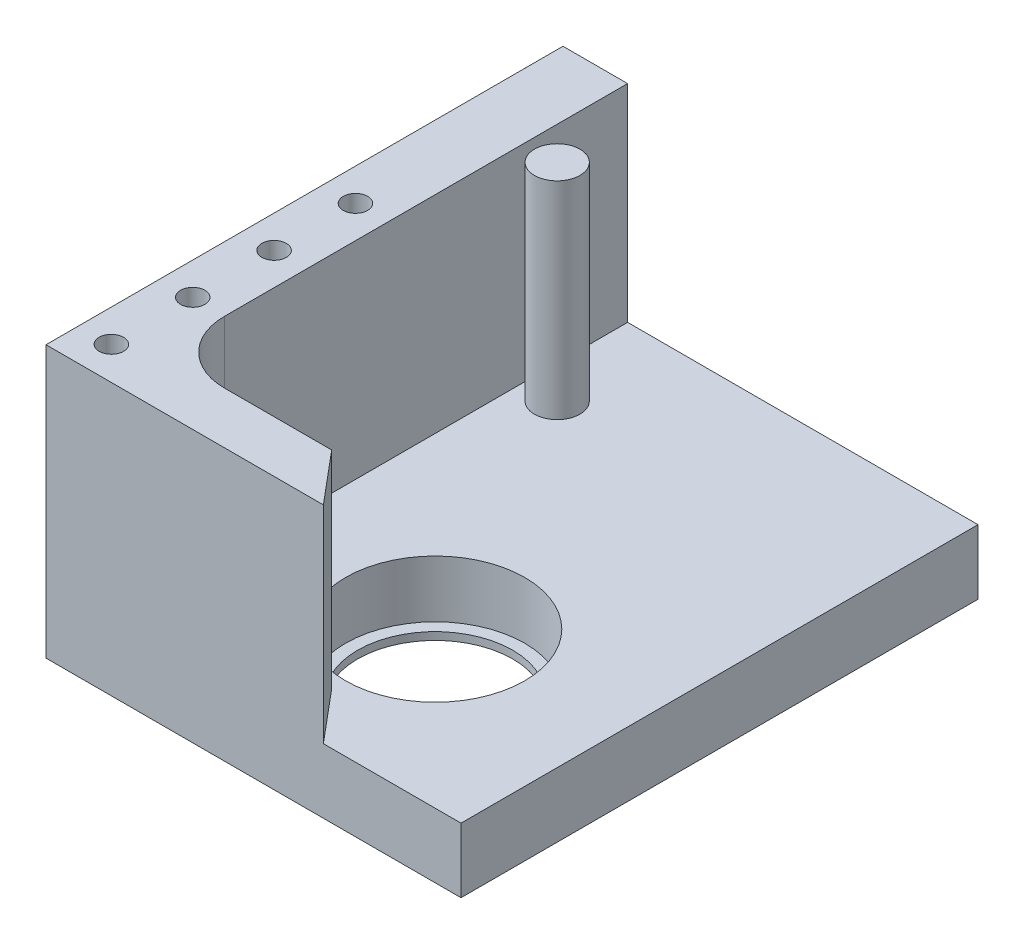
ISO-10303-21;
HEADER;
FILE_DESCRIPTION(('STEP AP214'),'2;1');
FILE_NAME('part.step','',(''),(''),'','','');
FILE_SCHEMA(('AUTOMOTIVE_DESIGN { 1 0 10303 214 1 1 1 1 }'));
ENDSEC;
DATA;
#1=APPLICATION_CONTEXT('core data for automotive mechanical design processes');
#2=APPLICATION_PROTOCOL_DEFINITION('international standard','automotive_design',2000,#1);
#3=PRODUCT_CONTEXT('',#1,'mechanical');
#4=PRODUCT('Part','Part','',(#3));
#5=PRODUCT_RELATED_PRODUCT_CATEGORY('part','',(#4));
#6=PRODUCT_DEFINITION_FORMATION('','',#4);
#7=PRODUCT_DEFINITION_CONTEXT('part definition',#1,'design');
#8=PRODUCT_DEFINITION('design','',#6,#7);
#9=PRODUCT_DEFINITION_SHAPE('','',#8);
#10=(LENGTH_UNIT() NAMED_UNIT(*) SI_UNIT(.MILLI.,.METRE.));
#11=(NAMED_UNIT(*) PLANE_ANGLE_UNIT() SI_UNIT($,.RADIAN.));
#12=(NAMED_UNIT(*) SI_UNIT($,.STERADIAN.) SOLID_ANGLE_UNIT());
#13=UNCERTAINTY_MEASURE_WITH_UNIT(LENGTH_MEASURE(1.E-05),#10,'distance_accuracy_value','');
#14=(GEOMETRIC_REPRESENTATION_CONTEXT(3) GLOBAL_UNCERTAINTY_ASSIGNED_CONTEXT((#13)) GLOBAL_UNIT_ASSIGNED_CONTEXT((#10,
#11,#12)) REPRESENTATION_CONTEXT('',''));
#15=CARTESIAN_POINT('',(0.,0.,0.));
#16=DIRECTION('',(0.,0.,1.));
#17=DIRECTION('',(1.,0.,0.));
#18=AXIS2_PLACEMENT_3D('',#15,#16,#17);
#19=CARTESIAN_POINT('',(0.,7.9375,0.));
#20=DIRECTION('',(0.,1.,0.));
#21=DIRECTION('',(0.,0.,1.));
#22=AXIS2_PLACEMENT_3D('',#19,#20,#21);
#23=PLANE('',#22);
#24=CARTESIAN_POINT('',(-16.7612,7.9375,-31.75));
#25=DIRECTION('',(0.,1.,0.));
#26=DIRECTION('',(0.,0.,1.));
#27=AXIS2_PLACEMENT_3D('',#24,#25,#26);
#28=CIRCLE('',#27,2.794);
#29=CARTESIAN_POINT('',(-16.7612,7.9375,-28.956));
#30=VERTEX_POINT('',#29);
#31=EDGE_CURVE('E140',#30,#30,#28,.T.);
#32=ORIENTED_EDGE('',*,*,#31,.F.);
#33=EDGE_LOOP('',(#32));
#34=FACE_BOUND('',#33,.T.);
#35=DIRECTION('',(0.,0.,-1.));
#36=VECTOR('',#35,1.);
#37=CARTESIAN_POINT('',(-20.8125,7.9375,19.05));
#38=LINE('',#37,#36);
#39=CARTESIAN_POINT('',(-20.8125,7.9375,5.08));
#40=VERTEX_POINT('',#39);
#41=CARTESIAN_POINT('',(-20.8125,7.9375,-44.45));
#42=VERTEX_POINT('',#41);
#43=EDGE_CURVE('E191',#40,#42,#38,.T.);
#44=ORIENTED_EDGE('',*,*,#43,.F.);
#45=CARTESIAN_POINT('',(-13.1925,7.9375,5.08));
#46=DIRECTION('',(0.,1.,0.));
#47=DIRECTION('',(0.,0.,1.));
#48=AXIS2_PLACEMENT_3D('',#45,#46,#47);
#49=CIRCLE('',#48,7.62);
#50=CARTESIAN_POINT('',(-13.1925,7.9375,12.7));
#51=VERTEX_POINT('',#50);
#52=EDGE_CURVE('E49',#40,#51,#49,.T.);
#53=ORIENTED_EDGE('',*,*,#52,.T.);
#54=DIRECTION('',(-1.,0.,0.));
#55=VECTOR('',#54,1.);
#56=CARTESIAN_POINT('',(-0.00989999999998978,7.9375,12.7));
#57=LINE('',#56,#55);
#58=CARTESIAN_POINT('',(-0.00989999999998978,7.9375,12.7));
#59=VERTEX_POINT('',#58);
#60=EDGE_CURVE('E188',#59,#51,#57,.T.);
#61=ORIENTED_EDGE('',*,*,#60,.F.);
#62=DIRECTION('',(0.642787609686535,0.,0.766044443118982));
#63=VECTOR('',#62,1.);
#64=CARTESIAN_POINT('',(-0.00989999999998978,7.9375,12.7));
#65=LINE('',#64,#63);
#66=CARTESIAN_POINT('',(5.31838265797568,7.9375,19.05));
#67=VERTEX_POINT('',#66);
#68=EDGE_CURVE('E181',#59,#67,#65,.T.);
#69=ORIENTED_EDGE('',*,*,#68,.T.);
#70=DIRECTION('',(-1.,0.,0.));
#71=VECTOR('',#70,1.);
#72=CARTESIAN_POINT('',(22.225,7.9375,19.05));
#73=LINE('',#72,#71);
#74=CARTESIAN_POINT('',(22.225,7.9375,19.05));
#75=VERTEX_POINT('',#74);
#76=EDGE_CURVE('E120',#75,#67,#73,.T.);
#77=ORIENTED_EDGE('',*,*,#76,.F.);
#78=DIRECTION('',(0.,0.,1.));
#79=VECTOR('',#78,1.);
#80=CARTESIAN_POINT('',(22.225,7.9375,-19.05));
#81=LINE('',#80,#79);
#82=CARTESIAN_POINT('',(22.225,7.9375,-44.45));
#83=VERTEX_POINT('',#82);
#84=EDGE_CURVE('E213',#83,#75,#81,.T.);
#85=ORIENTED_EDGE('',*,*,#84,.F.);
#86=DIRECTION('',(1.,0.,0.));
#87=VECTOR('',#86,1.);
#88=CARTESIAN_POINT('',(22.225,7.9375,-44.45));
#89=LINE('',#88,#87);
#90=EDGE_CURVE('E136',#42,#83,#89,.T.);
#91=ORIENTED_EDGE('',*,*,#90,.F.);
#92=EDGE_LOOP('',(#44,#53,#61,#69,#77,#85,#91));
#93=FACE_BOUND('',#92,.T.);
#94=CARTESIAN_POINT('',(0.,7.9375,0.));
#95=DIRECTION('',(0.,1.,0.));
#96=DIRECTION('',(0.,0.,1.));
#97=AXIS2_PLACEMENT_3D('',#94,#95,#96);
#98=CIRCLE('',#97,11.);
#99=CARTESIAN_POINT('',(0.,7.9375,11.));
#100=VERTEX_POINT('',#99);
#101=EDGE_CURVE('E208',#100,#100,#98,.T.);
#102=ORIENTED_EDGE('',*,*,#101,.F.);
#103=EDGE_LOOP('',(#102));
#104=FACE_BOUND('',#103,.T.);
#105=ADVANCED_FACE('F41',(#34,#93,#104),#23,.T.);
#106=CARTESIAN_POINT('',(-20.8125,33.3375,19.05));
#107=DIRECTION('',(-1.,0.,0.));
#108=DIRECTION('',(0.,0.,1.));
#109=AXIS2_PLACEMENT_3D('',#106,#107,#108);
#110=PLANE('',#109);
#111=DIRECTION('',(0.,0.,-1.));
#112=VECTOR('',#111,1.);
#113=CARTESIAN_POINT('',(-20.8125,33.3375,19.05));
#114=LINE('',#113,#112);
#115=CARTESIAN_POINT('',(-20.8125,33.3375,5.08000000000001));
#116=VERTEX_POINT('',#115);
#117=CARTESIAN_POINT('',(-20.8125,33.3375,-44.45));
#118=VERTEX_POINT('',#117);
#119=EDGE_CURVE('E197',#116,#118,#114,.T.);
#120=ORIENTED_EDGE('',*,*,#119,.F.);
#121=DIRECTION('',(0.,1.,0.));
#122=VECTOR('',#121,1.);
#123=CARTESIAN_POINT('',(-20.8125,7.9375,5.08));
#124=LINE('',#123,#122);
#125=EDGE_CURVE('E61',#116,#40,#124,.F.);
#126=ORIENTED_EDGE('',*,*,#125,.T.);
#127=ORIENTED_EDGE('',*,*,#43,.T.);
#128=DIRECTION('',(0.,-1.,0.));
#129=VECTOR('',#128,1.);
#130=CARTESIAN_POINT('',(-20.8125,7.9375,-44.45));
#131=LINE('',#130,#129);
#132=EDGE_CURVE('E148',#118,#42,#131,.T.);
#133=ORIENTED_EDGE('',*,*,#132,.F.);
#134=EDGE_LOOP('',(#120,#126,#127,#133));
#135=FACE_BOUND('',#134,.T.);
#136=ADVANCED_FACE('F248',(#135),#110,.F.);
#137=CARTESIAN_POINT('',(22.225,7.9375,19.05));
#138=DIRECTION('',(0.,0.,1.));
#139=DIRECTION('',(1.,0.,0.));
#140=AXIS2_PLACEMENT_3D('',#137,#138,#139);
#141=PLANE('',#140);
#142=DIRECTION('',(-1.,0.,0.));
#143=VECTOR('',#142,1.);
#144=CARTESIAN_POINT('',(22.225,0.,19.05));
#145=LINE('',#144,#143);
#146=CARTESIAN_POINT('',(22.225,0.,19.05));
#147=VERTEX_POINT('',#146);
#148=CARTESIAN_POINT('',(-28.75,0.,19.05));
#149=VERTEX_POINT('',#148);
#150=EDGE_CURVE('E207',#147,#149,#145,.T.);
#151=ORIENTED_EDGE('',*,*,#150,.F.);
#152=DIRECTION('',(0.,-1.,0.));
#153=VECTOR('',#152,1.);
#154=CARTESIAN_POINT('',(22.225,7.9375,19.05));
#155=LINE('',#154,#153);
#156=EDGE_CURVE('E116',#75,#147,#155,.T.);
#157=ORIENTED_EDGE('',*,*,#156,.F.);
#158=ORIENTED_EDGE('',*,*,#76,.T.);
#159=DIRECTION('',(0.,1.,0.));
#160=VECTOR('',#159,1.);
#161=CARTESIAN_POINT('',(5.31838265797567,-0.002000000000002,19.05));
#162=LINE('',#161,#160);
#163=CARTESIAN_POINT('',(5.31838265797567,33.3375,19.05));
#164=VERTEX_POINT('',#163);
#165=EDGE_CURVE('E178',#67,#164,#162,.T.);
#166=ORIENTED_EDGE('',*,*,#165,.T.);
#167=DIRECTION('',(1.,0.,0.));
#168=VECTOR('',#167,1.);
#169=CARTESIAN_POINT('',(-28.75,33.3375,19.05));
#170=LINE('',#169,#168);
#171=CARTESIAN_POINT('',(-28.75,33.3375,19.05));
#172=VERTEX_POINT('',#171);
#173=EDGE_CURVE('E195',#172,#164,#170,.T.);
#174=ORIENTED_EDGE('',*,*,#173,.F.);
#175=DIRECTION('',(0.,-1.,0.));
#176=VECTOR('',#175,1.);
#177=CARTESIAN_POINT('',(-28.75,7.9375,19.05));
#178=LINE('',#177,#176);
#179=EDGE_CURVE('E215',#172,#149,#178,.T.);
#180=ORIENTED_EDGE('',*,*,#179,.T.);
#181=EDGE_LOOP('',(#151,#157,#158,#166,#174,#180));
#182=FACE_BOUND('',#181,.T.);
#183=ADVANCED_FACE('F256',(#182),#141,.T.);
#184=CARTESIAN_POINT('',(22.225,7.9375,-19.05));
#185=DIRECTION('',(1.,0.,0.));
#186=DIRECTION('',(0.,0.,-1.));
#187=AXIS2_PLACEMENT_3D('',#184,#185,#186);
#188=PLANE('',#187);
#189=DIRECTION('',(0.,0.,1.));
#190=VECTOR('',#189,1.);
#191=CARTESIAN_POINT('',(22.225,0.,-19.05));
#192=LINE('',#191,#190);
#193=CARTESIAN_POINT('',(22.225,0.,-44.45));
#194=VERTEX_POINT('',#193);
#195=EDGE_CURVE('E110',#194,#147,#192,.T.);
#196=ORIENTED_EDGE('',*,*,#195,.F.);
#197=DIRECTION('',(0.,-1.,0.));
#198=VECTOR('',#197,1.);
#199=CARTESIAN_POINT('',(22.225,0.,-44.45));
#200=LINE('',#199,#198);
#201=EDGE_CURVE('E115',#83,#194,#200,.T.);
#202=ORIENTED_EDGE('',*,*,#201,.F.);
#203=ORIENTED_EDGE('',*,*,#84,.T.);
#204=ORIENTED_EDGE('',*,*,#156,.T.);
#205=EDGE_LOOP('',(#196,#202,#203,#204));
#206=FACE_BOUND('',#205,.T.);
#207=ADVANCED_FACE('F112',(#206),#188,.T.);
#208=CARTESIAN_POINT('',(-28.75,7.9375,-19.05));
#209=DIRECTION('',(1.,0.,0.));
#210=DIRECTION('',(0.,0.,-1.));
#211=AXIS2_PLACEMENT_3D('',#208,#209,#210);
#212=PLANE('',#211);
#213=DIRECTION('',(0.,0.,1.));
#214=VECTOR('',#213,1.);
#215=CARTESIAN_POINT('',(-28.75,0.,-19.05));
#216=LINE('',#215,#214);
#217=CARTESIAN_POINT('',(-28.75,0.,-44.45));
#218=VERTEX_POINT('',#217);
#219=EDGE_CURVE('E121',#218,#149,#216,.T.);
#220=ORIENTED_EDGE('',*,*,#219,.T.);
#221=ORIENTED_EDGE('',*,*,#179,.F.);
#222=DIRECTION('',(0.,0.,1.));
#223=VECTOR('',#222,1.);
#224=CARTESIAN_POINT('',(-28.75,33.3375,19.05));
#225=LINE('',#224,#223);
#226=CARTESIAN_POINT('',(-28.75,33.3375,-44.45));
#227=VERTEX_POINT('',#226);
#228=EDGE_CURVE('E192',#227,#172,#225,.T.);
#229=ORIENTED_EDGE('',*,*,#228,.F.);
#230=DIRECTION('',(0.,1.,0.));
#231=VECTOR('',#230,1.);
#232=CARTESIAN_POINT('',(-28.75,33.3375,-44.45));
#233=LINE('',#232,#231);
#234=EDGE_CURVE('E130',#218,#227,#233,.T.);
#235=ORIENTED_EDGE('',*,*,#234,.F.);
#236=EDGE_LOOP('',(#220,#221,#229,#235));
#237=FACE_BOUND('',#236,.T.);
#238=ADVANCED_FACE('F265',(#237),#212,.F.);
#239=CARTESIAN_POINT('',(0.,0.,0.));
#240=DIRECTION('',(0.,1.,0.));
#241=DIRECTION('',(0.,0.,1.));
#242=AXIS2_PLACEMENT_3D('',#239,#240,#241);
#243=PLANE('',#242);
#244=CARTESIAN_POINT('',(0.,0.,0.));
#245=DIRECTION('',(0.,1.,0.));
#246=DIRECTION('',(0.,0.,1.));
#247=AXIS2_PLACEMENT_3D('',#244,#245,#246);
#248=CIRCLE('',#247,9.525);
#249=CARTESIAN_POINT('',(0.,0.,9.525));
#250=VERTEX_POINT('',#249);
#251=EDGE_CURVE('E199',#250,#250,#248,.T.);
#252=ORIENTED_EDGE('',*,*,#251,.T.);
#253=EDGE_LOOP('',(#252));
#254=FACE_BOUND('',#253,.T.);
#255=ORIENTED_EDGE('',*,*,#150,.T.);
#256=ORIENTED_EDGE('',*,*,#219,.F.);
#257=DIRECTION('',(-1.,0.,0.));
#258=VECTOR('',#257,1.);
#259=CARTESIAN_POINT('',(-28.75,0.,-44.45));
#260=LINE('',#259,#258);
#261=EDGE_CURVE('E124',#194,#218,#260,.T.);
#262=ORIENTED_EDGE('',*,*,#261,.F.);
#263=ORIENTED_EDGE('',*,*,#195,.T.);
#264=EDGE_LOOP('',(#255,#256,#262,#263));
#265=FACE_BOUND('',#264,.T.);
#266=ADVANCED_FACE('F125',(#254,#265),#243,.F.);
#267=CARTESIAN_POINT('',(0.,0.9375,0.));
#268=DIRECTION('',(0.,1.,0.));
#269=DIRECTION('',(0.,0.,1.));
#270=AXIS2_PLACEMENT_3D('',#267,#268,#269);
#271=CYLINDRICAL_SURFACE('',#270,11.);
#272=CARTESIAN_POINT('',(0.,0.9375,0.));
#273=DIRECTION('',(0.,1.,0.));
#274=DIRECTION('',(0.,0.,1.));
#275=AXIS2_PLACEMENT_3D('',#272,#273,#274);
#276=CIRCLE('',#275,11.);
#277=CARTESIAN_POINT('',(0.,0.9375,11.));
#278=VERTEX_POINT('',#277);
#279=EDGE_CURVE('E204',#278,#278,#276,.T.);
#280=ORIENTED_EDGE('',*,*,#279,.F.);
#281=EDGE_LOOP('',(#280));
#282=FACE_BOUND('',#281,.T.);
#283=ORIENTED_EDGE('',*,*,#101,.T.);
#284=EDGE_LOOP('',(#283));
#285=FACE_BOUND('',#284,.T.);
#286=ADVANCED_FACE('F261',(#282,#285),#271,.F.);
#287=CARTESIAN_POINT('',(0.,0.9375,0.));
#288=DIRECTION('',(0.,1.,0.));
#289=DIRECTION('',(0.,0.,1.));
#290=AXIS2_PLACEMENT_3D('',#287,#288,#289);
#291=PLANE('',#290);
#292=CARTESIAN_POINT('',(0.,0.9375,0.));
#293=DIRECTION('',(0.,1.,0.));
#294=DIRECTION('',(0.,0.,1.));
#295=AXIS2_PLACEMENT_3D('',#292,#293,#294);
#296=CIRCLE('',#295,9.525);
#297=CARTESIAN_POINT('',(0.,0.9375,9.525));
#298=VERTEX_POINT('',#297);
#299=EDGE_CURVE('E203',#298,#298,#296,.T.);
#300=ORIENTED_EDGE('',*,*,#299,.F.);
#301=EDGE_LOOP('',(#300));
#302=FACE_BOUND('',#301,.T.);
#303=ORIENTED_EDGE('',*,*,#279,.T.);
#304=EDGE_LOOP('',(#303));
#305=FACE_BOUND('',#304,.T.);
#306=ADVANCED_FACE('F290',(#302,#305),#291,.T.);
#307=CARTESIAN_POINT('',(0.,0.,0.));
#308=DIRECTION('',(0.,1.,0.));
#309=DIRECTION('',(0.,0.,1.));
#310=AXIS2_PLACEMENT_3D('',#307,#308,#309);
#311=CYLINDRICAL_SURFACE('',#310,9.525);
#312=ORIENTED_EDGE('',*,*,#299,.T.);
#313=EDGE_LOOP('',(#312));
#314=FACE_BOUND('',#313,.T.);
#315=ORIENTED_EDGE('',*,*,#251,.F.);
#316=EDGE_LOOP('',(#315));
#317=FACE_BOUND('',#316,.T.);
#318=ADVANCED_FACE('F284',(#314,#317),#311,.F.);
#319=CARTESIAN_POINT('',(0.,33.3375,0.));
#320=DIRECTION('',(0.,-1.,0.));
#321=DIRECTION('',(0.,0.,-1.));
#322=AXIS2_PLACEMENT_3D('',#319,#320,#321);
#323=PLANE('',#322);
#324=CARTESIAN_POINT('',(-24.78125,33.3375,-14.9903885987044));
#325=DIRECTION('',(0.,1.,0.));
#326=DIRECTION('',(0.,0.,1.));
#327=AXIS2_PLACEMENT_3D('',#324,#325,#326);
#328=CIRCLE('',#327,1.499999999994);
#329=CARTESIAN_POINT('',(-24.78125,33.3375,-13.4903885987104));
#330=VERTEX_POINT('',#329);
#331=EDGE_CURVE('E156',#330,#330,#328,.T.);
#332=ORIENTED_EDGE('',*,*,#331,.F.);
#333=EDGE_LOOP('',(#332));
#334=FACE_BOUND('',#333,.T.);
#335=CARTESIAN_POINT('',(-24.78125,33.3375,4.99679619956642));
#336=DIRECTION('',(0.,1.,0.));
#337=DIRECTION('',(0.,0.,1.));
#338=AXIS2_PLACEMENT_3D('',#335,#336,#337);
#339=CIRCLE('',#338,1.5);
#340=CARTESIAN_POINT('',(-24.78125,33.3375,6.49679619956642));
#341=VERTEX_POINT('',#340);
#342=EDGE_CURVE('E160',#341,#341,#339,.T.);
#343=ORIENTED_EDGE('',*,*,#342,.F.);
#344=EDGE_LOOP('',(#343));
#345=FACE_BOUND('',#344,.T.);
#346=CARTESIAN_POINT('',(-24.78125,33.3375,14.9903885987044));
#347=DIRECTION('',(0.,1.,0.));
#348=DIRECTION('',(0.,0.,1.));
#349=AXIS2_PLACEMENT_3D('',#346,#347,#348);
#350=CIRCLE('',#349,1.499999999994);
#351=CARTESIAN_POINT('',(-24.78125,33.3375,16.4903885986984));
#352=VERTEX_POINT('',#351);
#353=EDGE_CURVE('E171',#352,#352,#350,.T.);
#354=ORIENTED_EDGE('',*,*,#353,.F.);
#355=EDGE_LOOP('',(#354));
#356=FACE_BOUND('',#355,.T.);
#357=CARTESIAN_POINT('',(-24.78125,33.3375,-4.99679619956898));
#358=DIRECTION('',(0.,1.,0.));
#359=DIRECTION('',(0.,0.,1.));
#360=AXIS2_PLACEMENT_3D('',#357,#358,#359);
#361=CIRCLE('',#360,1.5);
#362=CARTESIAN_POINT('',(-24.78125,33.3375,-3.49679619956898));
#363=VERTEX_POINT('',#362);
#364=EDGE_CURVE('E159',#363,#363,#361,.T.);
#365=ORIENTED_EDGE('',*,*,#364,.F.);
#366=EDGE_LOOP('',(#365));
#367=FACE_BOUND('',#366,.T.);
#368=ORIENTED_EDGE('',*,*,#228,.T.);
#369=ORIENTED_EDGE('',*,*,#173,.T.);
#370=DIRECTION('',(-0.642787609686535,0.,-0.766044443118982));
#371=VECTOR('',#370,1.);
#372=CARTESIAN_POINT('',(-0.00989999999998978,33.3375,12.7));
#373=LINE('',#372,#371);
#374=CARTESIAN_POINT('',(-0.00989999999998978,33.3375,12.7));
#375=VERTEX_POINT('',#374);
#376=EDGE_CURVE('E155',#164,#375,#373,.T.);
#377=ORIENTED_EDGE('',*,*,#376,.T.);
#378=DIRECTION('',(-1.,0.,0.));
#379=VECTOR('',#378,1.);
#380=CARTESIAN_POINT('',(-0.00989999999998978,33.3375,12.7));
#381=LINE('',#380,#379);
#382=CARTESIAN_POINT('',(-13.1925,33.3375,12.7));
#383=VERTEX_POINT('',#382);
#384=EDGE_CURVE('E186',#375,#383,#381,.T.);
#385=ORIENTED_EDGE('',*,*,#384,.T.);
#386=CARTESIAN_POINT('',(-13.1925,33.3375,5.08000000000001));
#387=DIRECTION('',(0.,-1.,0.));
#388=DIRECTION('',(0.,0.,-1.));
#389=AXIS2_PLACEMENT_3D('',#386,#387,#388);
#390=CIRCLE('',#389,7.62);
#391=EDGE_CURVE('E11',#383,#116,#390,.T.);
#392=ORIENTED_EDGE('',*,*,#391,.T.);
#393=ORIENTED_EDGE('',*,*,#119,.T.);
#394=DIRECTION('',(1.,0.,0.));
#395=VECTOR('',#394,1.);
#396=CARTESIAN_POINT('',(-20.8125,33.3375,-44.45));
#397=LINE('',#396,#395);
#398=EDGE_CURVE('E145',#227,#118,#397,.T.);
#399=ORIENTED_EDGE('',*,*,#398,.F.);
#400=EDGE_LOOP('',(#368,#369,#377,#385,#392,#393,#399));
#401=FACE_BOUND('',#400,.T.);
#402=ADVANCED_FACE('F280',(#334,#345,#356,#367,#401),#323,.F.);
#403=CARTESIAN_POINT('',(-0.00989999999998978,33.3375,12.7));
#404=DIRECTION('',(0.,0.,1.));
#405=DIRECTION('',(0.,-1.,0.));
#406=AXIS2_PLACEMENT_3D('',#403,#404,#405);
#407=PLANE('',#406);
#408=ORIENTED_EDGE('',*,*,#60,.T.);
#409=DIRECTION('',(0.,1.,0.));
#410=VECTOR('',#409,1.);
#411=CARTESIAN_POINT('',(-13.1925,33.3375,12.7));
#412=LINE('',#411,#410);
#413=EDGE_CURVE('E219',#51,#383,#412,.T.);
#414=ORIENTED_EDGE('',*,*,#413,.T.);
#415=ORIENTED_EDGE('',*,*,#384,.F.);
#416=DIRECTION('',(0.,1.,0.));
#417=VECTOR('',#416,1.);
#418=CARTESIAN_POINT('',(-0.00989999999998978,33.3375,12.7));
#419=LINE('',#418,#417);
#420=EDGE_CURVE('E183',#59,#375,#419,.T.);
#421=ORIENTED_EDGE('',*,*,#420,.F.);
#422=EDGE_LOOP('',(#408,#414,#415,#421));
#423=FACE_BOUND('',#422,.T.);
#424=ADVANCED_FACE('F233',(#423),#407,.F.);
#425=CARTESIAN_POINT('',(-0.00989999999998978,-0.002000000000002,12.7));
#426=DIRECTION('',(0.766044443118982,0.,-0.642787609686535));
#427=DIRECTION('',(-0.642787609686535,0.,-0.766044443118982));
#428=AXIS2_PLACEMENT_3D('',#425,#426,#427);
#429=PLANE('',#428);
#430=ORIENTED_EDGE('',*,*,#68,.F.);
#431=ORIENTED_EDGE('',*,*,#420,.T.);
#432=ORIENTED_EDGE('',*,*,#376,.F.);
#433=ORIENTED_EDGE('',*,*,#165,.F.);
#434=EDGE_LOOP('',(#430,#431,#432,#433));
#435=FACE_BOUND('',#434,.T.);
#436=ADVANCED_FACE('F236',(#435),#429,.T.);
#437=CARTESIAN_POINT('',(-13.1925,33.3375,5.08000000000001));
#438=DIRECTION('',(0.,-1.,0.));
#439=DIRECTION('',(0.,0.,-1.));
#440=AXIS2_PLACEMENT_3D('',#437,#438,#439);
#441=CYLINDRICAL_SURFACE('',#440,7.62);
#442=ORIENTED_EDGE('',*,*,#52,.F.);
#443=ORIENTED_EDGE('',*,*,#125,.F.);
#444=ORIENTED_EDGE('',*,*,#391,.F.);
#445=ORIENTED_EDGE('',*,*,#413,.F.);
#446=EDGE_LOOP('',(#442,#443,#444,#445));
#447=FACE_BOUND('',#446,.T.);
#448=ADVANCED_FACE('F43',(#447),#441,.F.);
#449=CARTESIAN_POINT('',(-24.78125,26.329500046,-4.99679619956898));
#450=DIRECTION('',(0.,1.,0.));
#451=DIRECTION('',(0.,0.,1.));
#452=AXIS2_PLACEMENT_3D('',#449,#450,#451);
#453=CYLINDRICAL_SURFACE('',#452,1.5);
#454=CARTESIAN_POINT('',(-24.78125,26.329500046,-4.99679619956898));
#455=DIRECTION('',(0.,1.,0.));
#456=DIRECTION('',(0.,0.,1.));
#457=AXIS2_PLACEMENT_3D('',#454,#455,#456);
#458=CIRCLE('',#457,1.5);
#459=CARTESIAN_POINT('',(-24.78125,26.329500046,-3.49679619956898));
#460=VERTEX_POINT('',#459);
#461=EDGE_CURVE('E168',#460,#460,#458,.T.);
#462=ORIENTED_EDGE('',*,*,#461,.F.);
#463=EDGE_LOOP('',(#462));
#464=FACE_BOUND('',#463,.T.);
#465=ORIENTED_EDGE('',*,*,#364,.T.);
#466=EDGE_LOOP('',(#465));
#467=FACE_BOUND('',#466,.T.);
#468=ADVANCED_FACE('F235',(#464,#467),#453,.F.);
#469=CARTESIAN_POINT('',(-24.78125,26.329500046,-4.99679619956898));
#470=DIRECTION('',(0.,1.,0.));
#471=DIRECTION('',(0.,0.,1.));
#472=AXIS2_PLACEMENT_3D('',#469,#470,#471);
#473=PLANE('',#472);
#474=ORIENTED_EDGE('',*,*,#461,.T.);
#475=EDGE_LOOP('',(#474));
#476=FACE_BOUND('',#475,.T.);
#477=ADVANCED_FACE('F241',(#476),#473,.T.);
#478=CARTESIAN_POINT('',(-24.78125,26.329500046,14.9903885987044));
#479=DIRECTION('',(0.,1.,0.));
#480=DIRECTION('',(0.,0.,1.));
#481=AXIS2_PLACEMENT_3D('',#478,#479,#480);
#482=CYLINDRICAL_SURFACE('',#481,1.499999999994);
#483=CARTESIAN_POINT('',(-24.78125,26.329500046,14.9903885987044));
#484=DIRECTION('',(0.,1.,0.));
#485=DIRECTION('',(0.,0.,1.));
#486=AXIS2_PLACEMENT_3D('',#483,#484,#485);
#487=CIRCLE('',#486,1.499999999994);
#488=CARTESIAN_POINT('',(-24.78125,26.329500046,16.4903885986984));
#489=VERTEX_POINT('',#488);
#490=EDGE_CURVE('E163',#489,#489,#487,.T.);
#491=ORIENTED_EDGE('',*,*,#490,.F.);
#492=EDGE_LOOP('',(#491));
#493=FACE_BOUND('',#492,.T.);
#494=ORIENTED_EDGE('',*,*,#353,.T.);
#495=EDGE_LOOP('',(#494));
#496=FACE_BOUND('',#495,.T.);
#497=ADVANCED_FACE('F398',(#493,#496),#482,.F.);
#498=CARTESIAN_POINT('',(-24.78125,26.329500046,14.9903885987044));
#499=DIRECTION('',(0.,1.,0.));
#500=DIRECTION('',(0.,0.,1.));
#501=AXIS2_PLACEMENT_3D('',#498,#499,#500);
#502=PLANE('',#501);
#503=ORIENTED_EDGE('',*,*,#490,.T.);
#504=EDGE_LOOP('',(#503));
#505=FACE_BOUND('',#504,.T.);
#506=ADVANCED_FACE('F407',(#505),#502,.T.);
#507=CARTESIAN_POINT('',(-24.78125,26.329500046,4.99679619956642));
#508=DIRECTION('',(0.,1.,0.));
#509=DIRECTION('',(0.,0.,1.));
#510=AXIS2_PLACEMENT_3D('',#507,#508,#509);
#511=CYLINDRICAL_SURFACE('',#510,1.5);
#512=CARTESIAN_POINT('',(-24.78125,26.329500046,4.99679619956642));
#513=DIRECTION('',(0.,1.,0.));
#514=DIRECTION('',(0.,0.,1.));
#515=AXIS2_PLACEMENT_3D('',#512,#513,#514);
#516=CIRCLE('',#515,1.5);
#517=CARTESIAN_POINT('',(-24.78125,26.329500046,6.49679619956642));
#518=VERTEX_POINT('',#517);
#519=EDGE_CURVE('E151',#518,#518,#516,.T.);
#520=ORIENTED_EDGE('',*,*,#519,.F.);
#521=EDGE_LOOP('',(#520));
#522=FACE_BOUND('',#521,.T.);
#523=ORIENTED_EDGE('',*,*,#342,.T.);
#524=EDGE_LOOP('',(#523));
#525=FACE_BOUND('',#524,.T.);
#526=ADVANCED_FACE('F416',(#522,#525),#511,.F.);
#527=CARTESIAN_POINT('',(-24.78125,26.329500046,4.99679619956642));
#528=DIRECTION('',(0.,1.,0.));
#529=DIRECTION('',(0.,0.,1.));
#530=AXIS2_PLACEMENT_3D('',#527,#528,#529);
#531=PLANE('',#530);
#532=ORIENTED_EDGE('',*,*,#519,.T.);
#533=EDGE_LOOP('',(#532));
#534=FACE_BOUND('',#533,.T.);
#535=ADVANCED_FACE('F425',(#534),#531,.T.);
#536=CARTESIAN_POINT('',(-24.78125,26.329500046,-14.9903885987044));
#537=DIRECTION('',(0.,1.,0.));
#538=DIRECTION('',(0.,0.,1.));
#539=AXIS2_PLACEMENT_3D('',#536,#537,#538);
#540=CYLINDRICAL_SURFACE('',#539,1.499999999994);
#541=CARTESIAN_POINT('',(-24.78125,26.329500046,-14.9903885987044));
#542=DIRECTION('',(0.,1.,0.));
#543=DIRECTION('',(0.,0.,1.));
#544=AXIS2_PLACEMENT_3D('',#541,#542,#543);
#545=CIRCLE('',#544,1.499999999994);
#546=CARTESIAN_POINT('',(-24.78125,26.329500046,-13.4903885987104));
#547=VERTEX_POINT('',#546);
#548=EDGE_CURVE('E152',#547,#547,#545,.T.);
#549=ORIENTED_EDGE('',*,*,#548,.F.);
#550=EDGE_LOOP('',(#549));
#551=FACE_BOUND('',#550,.T.);
#552=ORIENTED_EDGE('',*,*,#331,.T.);
#553=EDGE_LOOP('',(#552));
#554=FACE_BOUND('',#553,.T.);
#555=ADVANCED_FACE('F434',(#551,#554),#540,.F.);
#556=CARTESIAN_POINT('',(-24.78125,26.329500046,-14.9903885987044));
#557=DIRECTION('',(0.,1.,0.));
#558=DIRECTION('',(0.,0.,1.));
#559=AXIS2_PLACEMENT_3D('',#556,#557,#558);
#560=PLANE('',#559);
#561=ORIENTED_EDGE('',*,*,#548,.T.);
#562=EDGE_LOOP('',(#561));
#563=FACE_BOUND('',#562,.T.);
#564=ADVANCED_FACE('F443',(#563),#560,.T.);
#565=CARTESIAN_POINT('',(0.,0.,-44.45));
#566=DIRECTION('',(0.,0.,1.));
#567=DIRECTION('',(1.,0.,0.));
#568=AXIS2_PLACEMENT_3D('',#565,#566,#567);
#569=PLANE('',#568);
#570=ORIENTED_EDGE('',*,*,#201,.T.);
#571=ORIENTED_EDGE('',*,*,#261,.T.);
#572=ORIENTED_EDGE('',*,*,#234,.T.);
#573=ORIENTED_EDGE('',*,*,#398,.T.);
#574=ORIENTED_EDGE('',*,*,#132,.T.);
#575=ORIENTED_EDGE('',*,*,#90,.T.);
#576=EDGE_LOOP('',(#570,#571,#572,#573,#574,#575));
#577=FACE_BOUND('',#576,.T.);
#578=ADVANCED_FACE('F133',(#577),#569,.F.);
#579=CARTESIAN_POINT('',(-16.7612,33.3375,-31.75));
#580=DIRECTION('',(0.,-1.,0.));
#581=DIRECTION('',(0.,0.,-1.));
#582=AXIS2_PLACEMENT_3D('',#579,#580,#581);
#583=CYLINDRICAL_SURFACE('',#582,2.794);
#584=CARTESIAN_POINT('',(-16.7612,33.3375,-31.75));
#585=DIRECTION('',(0.,1.,0.));
#586=DIRECTION('',(0.,0.,1.));
#587=AXIS2_PLACEMENT_3D('',#584,#585,#586);
#588=CIRCLE('',#587,2.794);
#589=CARTESIAN_POINT('',(-16.7612,33.3375,-28.956));
#590=VERTEX_POINT('',#589);
#591=EDGE_CURVE('E137',#590,#590,#588,.T.);
#592=ORIENTED_EDGE('',*,*,#591,.F.);
#593=EDGE_LOOP('',(#592));
#594=FACE_BOUND('',#593,.T.);
#595=ORIENTED_EDGE('',*,*,#31,.T.);
#596=EDGE_LOOP('',(#595));
#597=FACE_BOUND('',#596,.T.);
#598=ADVANCED_FACE('F458',(#594,#597),#583,.T.);
#599=CARTESIAN_POINT('',(-16.7612,33.3375,-31.75));
#600=DIRECTION('',(0.,1.,0.));
#601=DIRECTION('',(0.,0.,1.));
#602=AXIS2_PLACEMENT_3D('',#599,#600,#601);
#603=PLANE('',#602);
#604=ORIENTED_EDGE('',*,*,#591,.T.);
#605=EDGE_LOOP('',(#604));
#606=FACE_BOUND('',#605,.T.);
#607=ADVANCED_FACE('F465',(#606),#603,.T.);
#608=CLOSED_SHELL('',(#105,#136,#183,#207,#238,#266,#286,#306,#318,#402,#424,#436,#448,#468,
#477,#497,#506,#526,#535,#555,#564,#578,#598,#607));
#609=MANIFOLD_SOLID_BREP('B2',#608);
#610=ADVANCED_BREP_SHAPE_REPRESENTATION('',(#18,#609),#14);
#611=SHAPE_DEFINITION_REPRESENTATION(#9,#610);
ENDSEC;
END-ISO-10303-21;
